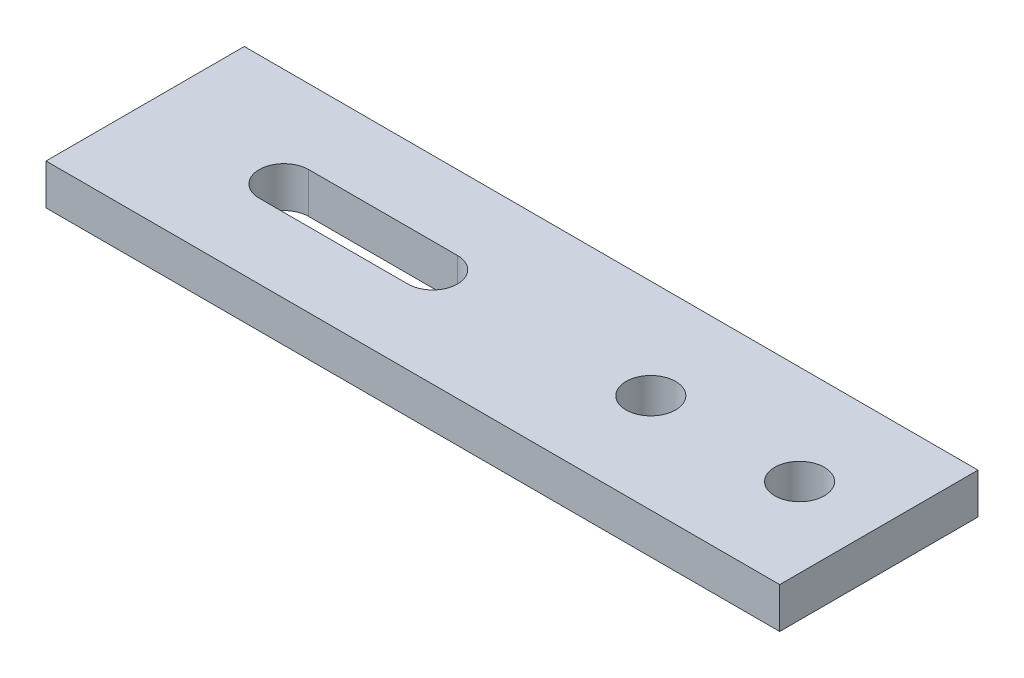
ISO-10303-21;
HEADER;
FILE_DESCRIPTION(('STEP AP214'),'2;1');
FILE_NAME('part.step','',(''),(''),'','','');
FILE_SCHEMA(('AUTOMOTIVE_DESIGN { 1 0 10303 214 1 1 1 1 }'));
ENDSEC;
DATA;
#1=APPLICATION_CONTEXT('core data for automotive mechanical design processes');
#2=APPLICATION_PROTOCOL_DEFINITION('international standard','automotive_design',2000,#1);
#3=PRODUCT_CONTEXT('',#1,'mechanical');
#4=PRODUCT('Part','Part','',(#3));
#5=PRODUCT_RELATED_PRODUCT_CATEGORY('part','',(#4));
#6=PRODUCT_DEFINITION_FORMATION('','',#4);
#7=PRODUCT_DEFINITION_CONTEXT('part definition',#1,'design');
#8=PRODUCT_DEFINITION('design','',#6,#7);
#9=PRODUCT_DEFINITION_SHAPE('','',#8);
#10=(LENGTH_UNIT() NAMED_UNIT(*) SI_UNIT(.MILLI.,.METRE.));
#11=(NAMED_UNIT(*) PLANE_ANGLE_UNIT() SI_UNIT($,.RADIAN.));
#12=(NAMED_UNIT(*) SI_UNIT($,.STERADIAN.) SOLID_ANGLE_UNIT());
#13=UNCERTAINTY_MEASURE_WITH_UNIT(LENGTH_MEASURE(1.E-05),#10,'distance_accuracy_value','');
#14=(GEOMETRIC_REPRESENTATION_CONTEXT(3) GLOBAL_UNCERTAINTY_ASSIGNED_CONTEXT((#13)) GLOBAL_UNIT_ASSIGNED_CONTEXT((#10,
#11,#12)) REPRESENTATION_CONTEXT('',''));
#15=CARTESIAN_POINT('',(0.,0.,0.));
#16=DIRECTION('',(0.,0.,1.));
#17=DIRECTION('',(1.,0.,0.));
#18=AXIS2_PLACEMENT_3D('',#15,#16,#17);
#19=CARTESIAN_POINT('',(0.,4.1,0.));
#20=DIRECTION('',(1.,0.,0.));
#21=DIRECTION('',(0.,0.,-1.));
#22=AXIS2_PLACEMENT_3D('',#19,#20,#21);
#23=PLANE('',#22);
#24=DIRECTION('',(0.,0.,1.));
#25=VECTOR('',#24,1.);
#26=CARTESIAN_POINT('',(0.,0.,0.));
#27=LINE('',#26,#25);
#28=CARTESIAN_POINT('',(0.,0.,-20.));
#29=VERTEX_POINT('',#28);
#30=CARTESIAN_POINT('',(0.,0.,0.));
#31=VERTEX_POINT('',#30);
#32=EDGE_CURVE('E151',#29,#31,#27,.T.);
#33=ORIENTED_EDGE('',*,*,#32,.T.);
#34=DIRECTION('',(0.,-1.,0.));
#35=VECTOR('',#34,1.);
#36=CARTESIAN_POINT('',(0.,4.1,0.));
#37=LINE('',#36,#35);
#38=CARTESIAN_POINT('',(0.,4.1,0.));
#39=VERTEX_POINT('',#38);
#40=EDGE_CURVE('E11',#39,#31,#37,.T.);
#41=ORIENTED_EDGE('',*,*,#40,.F.);
#42=DIRECTION('',(0.,0.,1.));
#43=VECTOR('',#42,1.);
#44=CARTESIAN_POINT('',(0.,4.1,0.));
#45=LINE('',#44,#43);
#46=CARTESIAN_POINT('',(0.,4.1,-20.));
#47=VERTEX_POINT('',#46);
#48=EDGE_CURVE('E140',#47,#39,#45,.T.);
#49=ORIENTED_EDGE('',*,*,#48,.F.);
#50=DIRECTION('',(0.,-1.,0.));
#51=VECTOR('',#50,1.);
#52=CARTESIAN_POINT('',(0.,4.1,-20.));
#53=LINE('',#52,#51);
#54=EDGE_CURVE('E150',#47,#29,#53,.T.);
#55=ORIENTED_EDGE('',*,*,#54,.T.);
#56=EDGE_LOOP('',(#33,#41,#49,#55));
#57=FACE_BOUND('',#56,.T.);
#58=ADVANCED_FACE('F37',(#57),#23,.F.);
#59=CARTESIAN_POINT('',(0.,4.1,0.));
#60=DIRECTION('',(0.,0.,-1.));
#61=DIRECTION('',(-1.,0.,0.));
#62=AXIS2_PLACEMENT_3D('',#59,#60,#61);
#63=PLANE('',#62);
#64=DIRECTION('',(1.,0.,0.));
#65=VECTOR('',#64,1.);
#66=CARTESIAN_POINT('',(0.,0.,0.));
#67=LINE('',#66,#65);
#68=CARTESIAN_POINT('',(74.,0.,0.));
#69=VERTEX_POINT('',#68);
#70=EDGE_CURVE('E154',#31,#69,#67,.T.);
#71=ORIENTED_EDGE('',*,*,#70,.T.);
#72=DIRECTION('',(0.,-1.,0.));
#73=VECTOR('',#72,1.);
#74=CARTESIAN_POINT('',(74.,4.1,0.));
#75=LINE('',#74,#73);
#76=CARTESIAN_POINT('',(74.,4.1,0.));
#77=VERTEX_POINT('',#76);
#78=EDGE_CURVE('E44',#77,#69,#75,.T.);
#79=ORIENTED_EDGE('',*,*,#78,.F.);
#80=DIRECTION('',(1.,0.,0.));
#81=VECTOR('',#80,1.);
#82=CARTESIAN_POINT('',(0.,4.1,0.));
#83=LINE('',#82,#81);
#84=EDGE_CURVE('E143',#39,#77,#83,.T.);
#85=ORIENTED_EDGE('',*,*,#84,.F.);
#86=ORIENTED_EDGE('',*,*,#40,.T.);
#87=EDGE_LOOP('',(#71,#79,#85,#86));
#88=FACE_BOUND('',#87,.T.);
#89=ADVANCED_FACE('F183',(#88),#63,.F.);
#90=CARTESIAN_POINT('',(74.,4.1,0.));
#91=DIRECTION('',(-1.,0.,0.));
#92=DIRECTION('',(0.,0.,1.));
#93=AXIS2_PLACEMENT_3D('',#90,#91,#92);
#94=PLANE('',#93);
#95=DIRECTION('',(0.,0.,-1.));
#96=VECTOR('',#95,1.);
#97=CARTESIAN_POINT('',(74.,0.,0.));
#98=LINE('',#97,#96);
#99=CARTESIAN_POINT('',(74.,0.,-20.));
#100=VERTEX_POINT('',#99);
#101=EDGE_CURVE('E157',#69,#100,#98,.T.);
#102=ORIENTED_EDGE('',*,*,#101,.T.);
#103=DIRECTION('',(0.,-1.,0.));
#104=VECTOR('',#103,1.);
#105=CARTESIAN_POINT('',(74.,4.1,-20.));
#106=LINE('',#105,#104);
#107=CARTESIAN_POINT('',(74.,4.1,-20.));
#108=VERTEX_POINT('',#107);
#109=EDGE_CURVE('E162',#108,#100,#106,.T.);
#110=ORIENTED_EDGE('',*,*,#109,.F.);
#111=DIRECTION('',(0.,0.,-1.));
#112=VECTOR('',#111,1.);
#113=CARTESIAN_POINT('',(74.,4.1,0.));
#114=LINE('',#113,#112);
#115=EDGE_CURVE('E146',#77,#108,#114,.T.);
#116=ORIENTED_EDGE('',*,*,#115,.F.);
#117=ORIENTED_EDGE('',*,*,#78,.T.);
#118=EDGE_LOOP('',(#102,#110,#116,#117));
#119=FACE_BOUND('',#118,.T.);
#120=ADVANCED_FACE('F169',(#119),#94,.F.);
#121=CARTESIAN_POINT('',(0.,4.1,-20.));
#122=DIRECTION('',(0.,0.,1.));
#123=DIRECTION('',(1.,0.,0.));
#124=AXIS2_PLACEMENT_3D('',#121,#122,#123);
#125=PLANE('',#124);
#126=DIRECTION('',(-1.,0.,0.));
#127=VECTOR('',#126,1.);
#128=CARTESIAN_POINT('',(0.,0.,-20.));
#129=LINE('',#128,#127);
#130=EDGE_CURVE('E144',#100,#29,#129,.T.);
#131=ORIENTED_EDGE('',*,*,#130,.T.);
#132=ORIENTED_EDGE('',*,*,#54,.F.);
#133=DIRECTION('',(-1.,0.,0.));
#134=VECTOR('',#133,1.);
#135=CARTESIAN_POINT('',(0.,4.1,-20.));
#136=LINE('',#135,#134);
#137=EDGE_CURVE('E148',#108,#47,#136,.T.);
#138=ORIENTED_EDGE('',*,*,#137,.F.);
#139=ORIENTED_EDGE('',*,*,#109,.T.);
#140=EDGE_LOOP('',(#131,#132,#138,#139));
#141=FACE_BOUND('',#140,.T.);
#142=ADVANCED_FACE('F176',(#141),#125,.F.);
#143=CARTESIAN_POINT('',(0.,4.1,0.));
#144=DIRECTION('',(0.,-1.,0.));
#145=DIRECTION('',(0.,0.,-1.));
#146=AXIS2_PLACEMENT_3D('',#143,#144,#145);
#147=PLANE('',#146);
#148=CARTESIAN_POINT('',(66.,4.1,-10.));
#149=DIRECTION('',(0.,1.,0.));
#150=DIRECTION('',(0.,0.,1.));
#151=AXIS2_PLACEMENT_3D('',#148,#149,#150);
#152=CIRCLE('',#151,2.5);
#153=CARTESIAN_POINT('',(66.,4.1,-7.5));
#154=VERTEX_POINT('',#153);
#155=EDGE_CURVE('E224',#154,#154,#152,.T.);
#156=ORIENTED_EDGE('',*,*,#155,.F.);
#157=EDGE_LOOP('',(#156));
#158=FACE_BOUND('',#157,.T.);
#159=CARTESIAN_POINT('',(51.,4.1,-10.));
#160=DIRECTION('',(0.,1.,0.));
#161=DIRECTION('',(0.,0.,1.));
#162=AXIS2_PLACEMENT_3D('',#159,#160,#161);
#163=CIRCLE('',#162,2.5);
#164=CARTESIAN_POINT('',(51.,4.1,-7.49999999999999));
#165=VERTEX_POINT('',#164);
#166=EDGE_CURVE('E125',#165,#165,#163,.T.);
#167=ORIENTED_EDGE('',*,*,#166,.F.);
#168=EDGE_LOOP('',(#167));
#169=FACE_BOUND('',#168,.T.);
#170=DIRECTION('',(1.,0.,0.));
#171=VECTOR('',#170,1.);
#172=CARTESIAN_POINT('',(14.,4.1,-7.5));
#173=LINE('',#172,#171);
#174=CARTESIAN_POINT('',(14.,4.1,-7.5));
#175=VERTEX_POINT('',#174);
#176=CARTESIAN_POINT('',(29.,4.1,-7.50000000000001));
#177=VERTEX_POINT('',#176);
#178=EDGE_CURVE('E131',#175,#177,#173,.T.);
#179=ORIENTED_EDGE('',*,*,#178,.F.);
#180=CARTESIAN_POINT('',(14.,4.1,-10.));
#181=DIRECTION('',(0.,1.,0.));
#182=DIRECTION('',(0.,0.,1.));
#183=AXIS2_PLACEMENT_3D('',#180,#181,#182);
#184=CIRCLE('',#183,2.5);
#185=CARTESIAN_POINT('',(14.,4.1,-12.5));
#186=VERTEX_POINT('',#185);
#187=EDGE_CURVE('E51',#186,#175,#184,.T.);
#188=ORIENTED_EDGE('',*,*,#187,.F.);
#189=DIRECTION('',(-1.,0.,0.));
#190=VECTOR('',#189,1.);
#191=CARTESIAN_POINT('',(14.,4.1,-12.5));
#192=LINE('',#191,#190);
#193=CARTESIAN_POINT('',(29.,4.1,-12.5));
#194=VERTEX_POINT('',#193);
#195=EDGE_CURVE('E119',#194,#186,#192,.T.);
#196=ORIENTED_EDGE('',*,*,#195,.F.);
#197=CARTESIAN_POINT('',(29.,4.1,-10.));
#198=DIRECTION('',(0.,1.,0.));
#199=DIRECTION('',(0.,0.,1.));
#200=AXIS2_PLACEMENT_3D('',#197,#198,#199);
#201=CIRCLE('',#200,2.5);
#202=EDGE_CURVE('E122',#177,#194,#201,.T.);
#203=ORIENTED_EDGE('',*,*,#202,.F.);
#204=EDGE_LOOP('',(#179,#188,#196,#203));
#205=FACE_BOUND('',#204,.T.);
#206=ORIENTED_EDGE('',*,*,#48,.T.);
#207=ORIENTED_EDGE('',*,*,#84,.T.);
#208=ORIENTED_EDGE('',*,*,#115,.T.);
#209=ORIENTED_EDGE('',*,*,#137,.T.);
#210=EDGE_LOOP('',(#206,#207,#208,#209));
#211=FACE_BOUND('',#210,.T.);
#212=ADVANCED_FACE('F182',(#158,#169,#205,#211),#147,.F.);
#213=CARTESIAN_POINT('',(0.,0.,0.));
#214=DIRECTION('',(0.,-1.,0.));
#215=DIRECTION('',(0.,0.,-1.));
#216=AXIS2_PLACEMENT_3D('',#213,#214,#215);
#217=PLANE('',#216);
#218=CARTESIAN_POINT('',(66.,0.,-10.));
#219=DIRECTION('',(0.,1.,0.));
#220=DIRECTION('',(0.,0.,1.));
#221=AXIS2_PLACEMENT_3D('',#218,#219,#220);
#222=CIRCLE('',#221,2.5);
#223=CARTESIAN_POINT('',(66.,0.,-7.5));
#224=VERTEX_POINT('',#223);
#225=EDGE_CURVE('E155',#224,#224,#222,.T.);
#226=ORIENTED_EDGE('',*,*,#225,.T.);
#227=EDGE_LOOP('',(#226));
#228=FACE_BOUND('',#227,.T.);
#229=CARTESIAN_POINT('',(51.,0.,-10.));
#230=DIRECTION('',(0.,1.,0.));
#231=DIRECTION('',(0.,0.,1.));
#232=AXIS2_PLACEMENT_3D('',#229,#230,#231);
#233=CIRCLE('',#232,2.5);
#234=CARTESIAN_POINT('',(51.,0.,-7.49999999999999));
#235=VERTEX_POINT('',#234);
#236=EDGE_CURVE('E225',#235,#235,#233,.T.);
#237=ORIENTED_EDGE('',*,*,#236,.T.);
#238=EDGE_LOOP('',(#237));
#239=FACE_BOUND('',#238,.T.);
#240=CARTESIAN_POINT('',(14.,0.,-10.));
#241=DIRECTION('',(0.,1.,0.));
#242=DIRECTION('',(0.,0.,1.));
#243=AXIS2_PLACEMENT_3D('',#240,#241,#242);
#244=CIRCLE('',#243,2.5);
#245=CARTESIAN_POINT('',(14.,0.,-12.5));
#246=VERTEX_POINT('',#245);
#247=CARTESIAN_POINT('',(14.,0.,-7.5));
#248=VERTEX_POINT('',#247);
#249=EDGE_CURVE('E103',#246,#248,#244,.T.);
#250=ORIENTED_EDGE('',*,*,#249,.T.);
#251=DIRECTION('',(1.,0.,0.));
#252=VECTOR('',#251,1.);
#253=CARTESIAN_POINT('',(14.,0.,-7.5));
#254=LINE('',#253,#252);
#255=CARTESIAN_POINT('',(29.,0.,-7.50000000000001));
#256=VERTEX_POINT('',#255);
#257=EDGE_CURVE('E112',#248,#256,#254,.T.);
#258=ORIENTED_EDGE('',*,*,#257,.T.);
#259=CARTESIAN_POINT('',(29.,0.,-10.));
#260=DIRECTION('',(0.,1.,0.));
#261=DIRECTION('',(0.,0.,1.));
#262=AXIS2_PLACEMENT_3D('',#259,#260,#261);
#263=CIRCLE('',#262,2.5);
#264=CARTESIAN_POINT('',(29.,0.,-12.5));
#265=VERTEX_POINT('',#264);
#266=EDGE_CURVE('E59',#256,#265,#263,.T.);
#267=ORIENTED_EDGE('',*,*,#266,.T.);
#268=DIRECTION('',(-1.,0.,0.));
#269=VECTOR('',#268,1.);
#270=CARTESIAN_POINT('',(14.,0.,-12.5));
#271=LINE('',#270,#269);
#272=EDGE_CURVE('E109',#265,#246,#271,.T.);
#273=ORIENTED_EDGE('',*,*,#272,.T.);
#274=EDGE_LOOP('',(#250,#258,#267,#273));
#275=FACE_BOUND('',#274,.T.);
#276=ORIENTED_EDGE('',*,*,#32,.F.);
#277=ORIENTED_EDGE('',*,*,#130,.F.);
#278=ORIENTED_EDGE('',*,*,#101,.F.);
#279=ORIENTED_EDGE('',*,*,#70,.F.);
#280=EDGE_LOOP('',(#276,#277,#278,#279));
#281=FACE_BOUND('',#280,.T.);
#282=ADVANCED_FACE('F116',(#228,#239,#275,#281),#217,.T.);
#283=CARTESIAN_POINT('',(14.,0.,-10.));
#284=DIRECTION('',(0.,1.,0.));
#285=DIRECTION('',(0.,0.,1.));
#286=AXIS2_PLACEMENT_3D('',#283,#284,#285);
#287=CYLINDRICAL_SURFACE('',#286,2.5);
#288=ORIENTED_EDGE('',*,*,#187,.T.);
#289=DIRECTION('',(0.,1.,0.));
#290=VECTOR('',#289,1.);
#291=CARTESIAN_POINT('',(14.,0.,-7.5));
#292=LINE('',#291,#290);
#293=EDGE_CURVE('E99',#248,#175,#292,.T.);
#294=ORIENTED_EDGE('',*,*,#293,.F.);
#295=ORIENTED_EDGE('',*,*,#249,.F.);
#296=DIRECTION('',(0.,1.,0.));
#297=VECTOR('',#296,1.);
#298=CARTESIAN_POINT('',(14.,0.,-12.5));
#299=LINE('',#298,#297);
#300=EDGE_CURVE('E135',#246,#186,#299,.T.);
#301=ORIENTED_EDGE('',*,*,#300,.T.);
#302=EDGE_LOOP('',(#288,#294,#295,#301));
#303=FACE_BOUND('',#302,.T.);
#304=ADVANCED_FACE('F101',(#303),#287,.F.);
#305=CARTESIAN_POINT('',(14.,0.,-12.5));
#306=DIRECTION('',(0.,0.,-1.));
#307=DIRECTION('',(-1.,0.,0.));
#308=AXIS2_PLACEMENT_3D('',#305,#306,#307);
#309=PLANE('',#308);
#310=ORIENTED_EDGE('',*,*,#195,.T.);
#311=ORIENTED_EDGE('',*,*,#300,.F.);
#312=ORIENTED_EDGE('',*,*,#272,.F.);
#313=DIRECTION('',(0.,1.,0.));
#314=VECTOR('',#313,1.);
#315=CARTESIAN_POINT('',(29.,0.,-12.5));
#316=LINE('',#315,#314);
#317=EDGE_CURVE('E137',#265,#194,#316,.T.);
#318=ORIENTED_EDGE('',*,*,#317,.T.);
#319=EDGE_LOOP('',(#310,#311,#312,#318));
#320=FACE_BOUND('',#319,.T.);
#321=ADVANCED_FACE('F201',(#320),#309,.F.);
#322=CARTESIAN_POINT('',(29.,0.,-10.));
#323=DIRECTION('',(0.,1.,0.));
#324=DIRECTION('',(0.,0.,1.));
#325=AXIS2_PLACEMENT_3D('',#322,#323,#324);
#326=CYLINDRICAL_SURFACE('',#325,2.5);
#327=ORIENTED_EDGE('',*,*,#202,.T.);
#328=ORIENTED_EDGE('',*,*,#317,.F.);
#329=ORIENTED_EDGE('',*,*,#266,.F.);
#330=DIRECTION('',(0.,1.,0.));
#331=VECTOR('',#330,1.);
#332=CARTESIAN_POINT('',(29.,0.,-7.50000000000001));
#333=LINE('',#332,#331);
#334=EDGE_CURVE('E108',#256,#177,#333,.T.);
#335=ORIENTED_EDGE('',*,*,#334,.T.);
#336=EDGE_LOOP('',(#327,#328,#329,#335));
#337=FACE_BOUND('',#336,.T.);
#338=ADVANCED_FACE('F205',(#337),#326,.F.);
#339=CARTESIAN_POINT('',(14.,0.,-7.5));
#340=DIRECTION('',(0.,0.,1.));
#341=DIRECTION('',(1.,0.,0.));
#342=AXIS2_PLACEMENT_3D('',#339,#340,#341);
#343=PLANE('',#342);
#344=ORIENTED_EDGE('',*,*,#178,.T.);
#345=ORIENTED_EDGE('',*,*,#334,.F.);
#346=ORIENTED_EDGE('',*,*,#257,.F.);
#347=ORIENTED_EDGE('',*,*,#293,.T.);
#348=EDGE_LOOP('',(#344,#345,#346,#347));
#349=FACE_BOUND('',#348,.T.);
#350=ADVANCED_FACE('F113',(#349),#343,.F.);
#351=CARTESIAN_POINT('',(51.,0.,-10.));
#352=DIRECTION('',(0.,1.,0.));
#353=DIRECTION('',(0.,0.,1.));
#354=AXIS2_PLACEMENT_3D('',#351,#352,#353);
#355=CYLINDRICAL_SURFACE('',#354,2.5);
#356=ORIENTED_EDGE('',*,*,#236,.F.);
#357=EDGE_LOOP('',(#356));
#358=FACE_BOUND('',#357,.T.);
#359=ORIENTED_EDGE('',*,*,#166,.T.);
#360=EDGE_LOOP('',(#359));
#361=FACE_BOUND('',#360,.T.);
#362=ADVANCED_FACE('F204',(#358,#361),#355,.F.);
#363=CARTESIAN_POINT('',(66.,0.,-10.));
#364=DIRECTION('',(0.,1.,0.));
#365=DIRECTION('',(0.,0.,1.));
#366=AXIS2_PLACEMENT_3D('',#363,#364,#365);
#367=CYLINDRICAL_SURFACE('',#366,2.5);
#368=ORIENTED_EDGE('',*,*,#225,.F.);
#369=EDGE_LOOP('',(#368));
#370=FACE_BOUND('',#369,.T.);
#371=ORIENTED_EDGE('',*,*,#155,.T.);
#372=EDGE_LOOP('',(#371));
#373=FACE_BOUND('',#372,.T.);
#374=ADVANCED_FACE('F213',(#370,#373),#367,.F.);
#375=CLOSED_SHELL('',(#58,#89,#120,#142,#212,#282,#304,#321,#338,#350,#362,#374));
#376=MANIFOLD_SOLID_BREP('B2',#375);
#377=ADVANCED_BREP_SHAPE_REPRESENTATION('',(#18,#376),#14);
#378=SHAPE_DEFINITION_REPRESENTATION(#9,#377);
ENDSEC;
END-ISO-10303-21;
